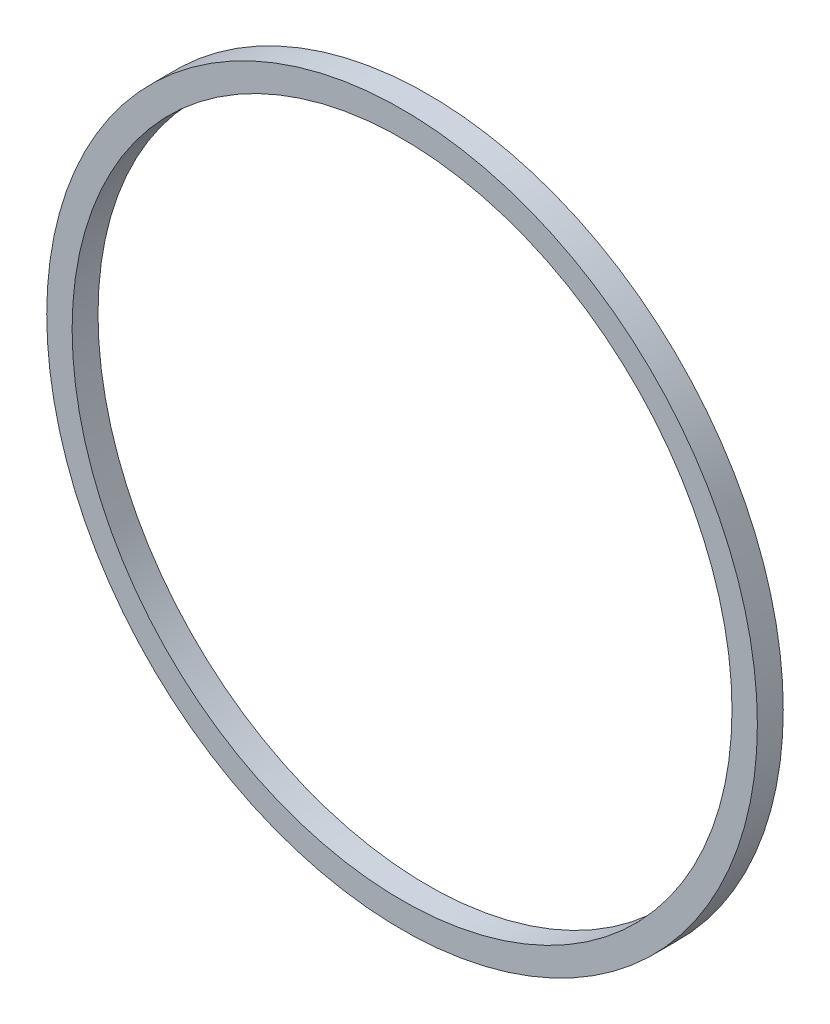
ISO-10303-21;
HEADER;
FILE_DESCRIPTION(('STEP AP214'),'2;1');
FILE_NAME('part.step','',(''),(''),'','','');
FILE_SCHEMA(('AUTOMOTIVE_DESIGN { 1 0 10303 214 1 1 1 1 }'));
ENDSEC;
DATA;
#1=APPLICATION_CONTEXT('core data for automotive mechanical design processes');
#2=APPLICATION_PROTOCOL_DEFINITION('international standard','automotive_design',2000,#1);
#3=PRODUCT_CONTEXT('',#1,'mechanical');
#4=PRODUCT('Part','Part','',(#3));
#5=PRODUCT_RELATED_PRODUCT_CATEGORY('part','',(#4));
#6=PRODUCT_DEFINITION_FORMATION('','',#4);
#7=PRODUCT_DEFINITION_CONTEXT('part definition',#1,'design');
#8=PRODUCT_DEFINITION('design','',#6,#7);
#9=PRODUCT_DEFINITION_SHAPE('','',#8);
#10=(LENGTH_UNIT() NAMED_UNIT(*) SI_UNIT(.MILLI.,.METRE.));
#11=(NAMED_UNIT(*) PLANE_ANGLE_UNIT() SI_UNIT($,.RADIAN.));
#12=(NAMED_UNIT(*) SI_UNIT($,.STERADIAN.) SOLID_ANGLE_UNIT());
#13=UNCERTAINTY_MEASURE_WITH_UNIT(LENGTH_MEASURE(1.E-05),#10,'distance_accuracy_value','');
#14=(GEOMETRIC_REPRESENTATION_CONTEXT(3) GLOBAL_UNCERTAINTY_ASSIGNED_CONTEXT((#13)) GLOBAL_UNIT_ASSIGNED_CONTEXT((#10,
#11,#12)) REPRESENTATION_CONTEXT('',''));
#15=CARTESIAN_POINT('',(0.,0.,0.));
#16=DIRECTION('',(0.,0.,1.));
#17=DIRECTION('',(1.,0.,0.));
#18=AXIS2_PLACEMENT_3D('',#15,#16,#17);
#19=CARTESIAN_POINT('',(0.,0.,5.1));
#20=DIRECTION('',(0.,0.,1.));
#21=DIRECTION('',(1.,0.,0.));
#22=AXIS2_PLACEMENT_3D('',#19,#20,#21);
#23=PLANE('',#22);
#24=CARTESIAN_POINT('',(0.,0.,5.1));
#25=DIRECTION('',(0.,0.,1.));
#26=DIRECTION('',(1.,0.,0.));
#27=AXIS2_PLACEMENT_3D('',#24,#25,#26);
#28=CIRCLE('',#27,70.);
#29=CARTESIAN_POINT('',(70.,0.,5.1));
#30=VERTEX_POINT('',#29);
#31=EDGE_CURVE('E10',#30,#30,#28,.T.);
#32=ORIENTED_EDGE('',*,*,#31,.T.);
#33=EDGE_LOOP('',(#32));
#34=FACE_BOUND('',#33,.T.);
#35=CARTESIAN_POINT('',(0.,0.,5.1));
#36=DIRECTION('',(0.,0.,1.));
#37=DIRECTION('',(1.,0.,0.));
#38=AXIS2_PLACEMENT_3D('',#35,#36,#37);
#39=CIRCLE('',#38,65.);
#40=CARTESIAN_POINT('',(65.,0.,5.1));
#41=VERTEX_POINT('',#40);
#42=EDGE_CURVE('E42',#41,#41,#39,.T.);
#43=ORIENTED_EDGE('',*,*,#42,.F.);
#44=EDGE_LOOP('',(#43));
#45=FACE_BOUND('',#44,.T.);
#46=ADVANCED_FACE('F31',(#34,#45),#23,.T.);
#47=CARTESIAN_POINT('',(0.,0.,0.));
#48=DIRECTION('',(0.,0.,1.));
#49=DIRECTION('',(1.,0.,0.));
#50=AXIS2_PLACEMENT_3D('',#47,#48,#49);
#51=PLANE('',#50);
#52=CARTESIAN_POINT('',(0.,0.,0.));
#53=DIRECTION('',(0.,0.,1.));
#54=DIRECTION('',(1.,0.,0.));
#55=AXIS2_PLACEMENT_3D('',#52,#53,#54);
#56=CIRCLE('',#55,70.);
#57=CARTESIAN_POINT('',(70.,0.,0.));
#58=VERTEX_POINT('',#57);
#59=EDGE_CURVE('E35',#58,#58,#56,.T.);
#60=ORIENTED_EDGE('',*,*,#59,.F.);
#61=EDGE_LOOP('',(#60));
#62=FACE_BOUND('',#61,.T.);
#63=CARTESIAN_POINT('',(0.,0.,0.));
#64=DIRECTION('',(0.,0.,1.));
#65=DIRECTION('',(1.,0.,0.));
#66=AXIS2_PLACEMENT_3D('',#63,#64,#65);
#67=CIRCLE('',#66,65.);
#68=CARTESIAN_POINT('',(65.,0.,0.));
#69=VERTEX_POINT('',#68);
#70=EDGE_CURVE('E44',#69,#69,#67,.T.);
#71=ORIENTED_EDGE('',*,*,#70,.T.);
#72=EDGE_LOOP('',(#71));
#73=FACE_BOUND('',#72,.T.);
#74=ADVANCED_FACE('F54',(#62,#73),#51,.F.);
#75=CARTESIAN_POINT('',(0.,0.,5.1));
#76=DIRECTION('',(0.,0.,-1.));
#77=DIRECTION('',(-1.,0.,0.));
#78=AXIS2_PLACEMENT_3D('',#75,#76,#77);
#79=CYLINDRICAL_SURFACE('',#78,70.);
#80=ORIENTED_EDGE('',*,*,#31,.F.);
#81=EDGE_LOOP('',(#80));
#82=FACE_BOUND('',#81,.T.);
#83=ORIENTED_EDGE('',*,*,#59,.T.);
#84=EDGE_LOOP('',(#83));
#85=FACE_BOUND('',#84,.T.);
#86=ADVANCED_FACE('F33',(#82,#85),#79,.T.);
#87=CARTESIAN_POINT('',(0.,0.,5.1));
#88=DIRECTION('',(0.,0.,-1.));
#89=DIRECTION('',(-1.,0.,0.));
#90=AXIS2_PLACEMENT_3D('',#87,#88,#89);
#91=CYLINDRICAL_SURFACE('',#90,65.);
#92=ORIENTED_EDGE('',*,*,#42,.T.);
#93=EDGE_LOOP('',(#92));
#94=FACE_BOUND('',#93,.T.);
#95=ORIENTED_EDGE('',*,*,#70,.F.);
#96=EDGE_LOOP('',(#95));
#97=FACE_BOUND('',#96,.T.);
#98=ADVANCED_FACE('F50',(#94,#97),#91,.F.);
#99=CLOSED_SHELL('',(#46,#74,#86,#98));
#100=MANIFOLD_SOLID_BREP('B2',#99);
#101=ADVANCED_BREP_SHAPE_REPRESENTATION('',(#18,#100),#14);
#102=SHAPE_DEFINITION_REPRESENTATION(#9,#101);
ENDSEC;
END-ISO-10303-21;
